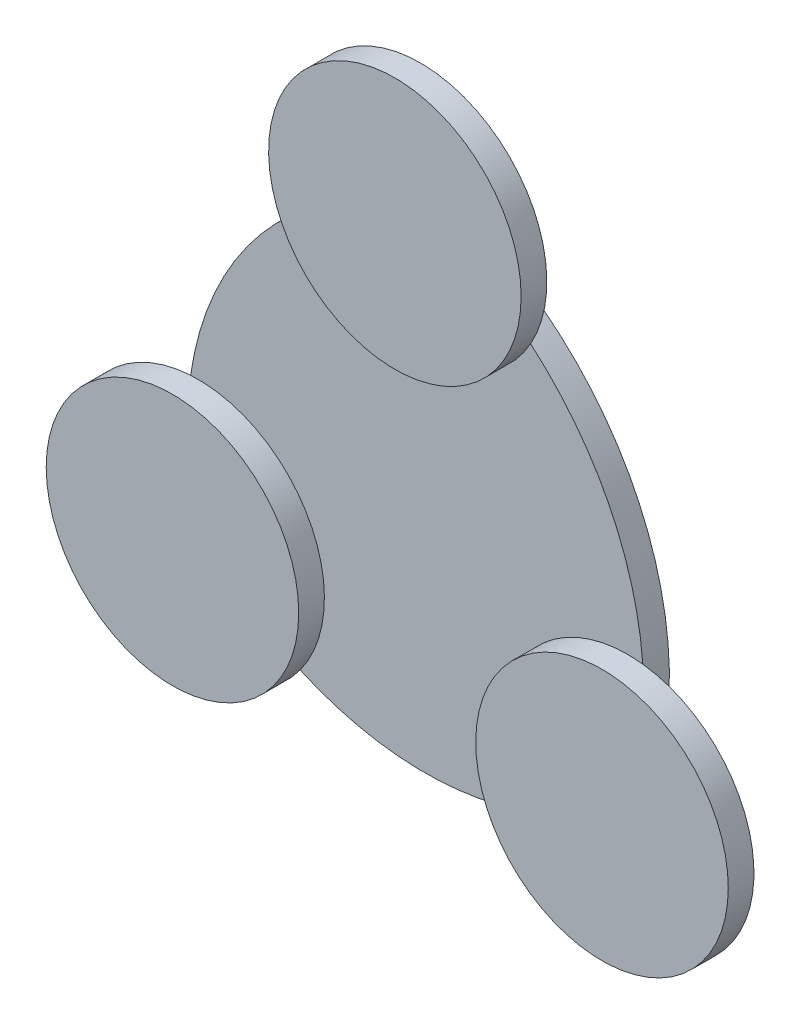
ISO-10303-21;
HEADER;
FILE_DESCRIPTION(('STEP AP214'),'2;1');
FILE_NAME('part.step','',(''),(''),'','','');
FILE_SCHEMA(('AUTOMOTIVE_DESIGN { 1 0 10303 214 1 1 1 1 }'));
ENDSEC;
DATA;
#1=APPLICATION_CONTEXT('core data for automotive mechanical design processes');
#2=APPLICATION_PROTOCOL_DEFINITION('international standard','automotive_design',2000,#1);
#3=PRODUCT_CONTEXT('',#1,'mechanical');
#4=PRODUCT('Part','Part','',(#3));
#5=PRODUCT_RELATED_PRODUCT_CATEGORY('part','',(#4));
#6=PRODUCT_DEFINITION_FORMATION('','',#4);
#7=PRODUCT_DEFINITION_CONTEXT('part definition',#1,'design');
#8=PRODUCT_DEFINITION('design','',#6,#7);
#9=PRODUCT_DEFINITION_SHAPE('','',#8);
#10=(LENGTH_UNIT() NAMED_UNIT(*) SI_UNIT(.MILLI.,.METRE.));
#11=(NAMED_UNIT(*) PLANE_ANGLE_UNIT() SI_UNIT($,.RADIAN.));
#12=(NAMED_UNIT(*) SI_UNIT($,.STERADIAN.) SOLID_ANGLE_UNIT());
#13=UNCERTAINTY_MEASURE_WITH_UNIT(LENGTH_MEASURE(1.E-05),#10,'distance_accuracy_value','');
#14=(GEOMETRIC_REPRESENTATION_CONTEXT(3) GLOBAL_UNCERTAINTY_ASSIGNED_CONTEXT((#13)) GLOBAL_UNIT_ASSIGNED_CONTEXT((#10,
#11,#12)) REPRESENTATION_CONTEXT('',''));
#15=CARTESIAN_POINT('',(0.,0.,0.));
#16=DIRECTION('',(0.,0.,1.));
#17=DIRECTION('',(1.,0.,0.));
#18=AXIS2_PLACEMENT_3D('',#15,#16,#17);
#19=CARTESIAN_POINT('',(4.9924044219722,1.61592345324425,0.));
#20=DIRECTION('',(0.,0.,1.));
#21=DIRECTION('',(1.,0.,0.));
#22=AXIS2_PLACEMENT_3D('',#19,#20,#21);
#23=PLANE('',#22);
#24=CARTESIAN_POINT('',(9.5096189432336,-5.49038105676665,0.));
#25=DIRECTION('',(0.,0.,1.));
#26=DIRECTION('',(1.,0.,0.));
#27=AXIS2_PLACEMENT_3D('',#24,#25,#26);
#28=CIRCLE('',#27,36.7423461417478);
#29=CARTESIAN_POINT('',(0.,30.,0.));
#30=VERTEX_POINT('',#29);
#31=CARTESIAN_POINT('',(-25.9807621135331,-15.0000000000001,0.));
#32=VERTEX_POINT('',#31);
#33=EDGE_CURVE('E128',#30,#32,#28,.T.);
#34=ORIENTED_EDGE('',*,*,#33,.F.);
#35=CARTESIAN_POINT('',(-11.7681530935115,-5.96557095747744,0.));
#36=DIRECTION('',(0.,0.,1.));
#37=DIRECTION('',(-1.,0.,0.));
#38=AXIS2_PLACEMENT_3D('',#35,#36,#37);
#39=CIRCLE('',#38,37.8419307320553);
#40=CARTESIAN_POINT('',(24.197417863966,-17.7337240509888,0.));
#41=VERTEX_POINT('',#40);
#42=EDGE_CURVE('E143',#41,#30,#39,.T.);
#43=ORIENTED_EDGE('',*,*,#42,.F.);
#44=CARTESIAN_POINT('',(0.475189900710804,8.72222796325515,0.));
#45=DIRECTION('',(0.,0.,1.));
#46=DIRECTION('',(-1.,0.,0.));
#47=AXIS2_PLACEMENT_3D('',#44,#45,#46);
#48=CIRCLE('',#47,35.5339485073166);
#49=EDGE_CURVE('E141',#32,#41,#48,.T.);
#50=ORIENTED_EDGE('',*,*,#49,.F.);
#51=EDGE_LOOP('',(#34,#43,#50));
#52=FACE_BOUND('',#51,.T.);
#53=CARTESIAN_POINT('',(0.,0.,0.));
#54=DIRECTION('',(0.,0.,1.));
#55=DIRECTION('',(1.,0.,0.));
#56=AXIS2_PLACEMENT_3D('',#53,#54,#55);
#57=CIRCLE('',#56,15.25);
#58=CARTESIAN_POINT('',(15.25,0.,0.));
#59=VERTEX_POINT('',#58);
#60=EDGE_CURVE('E11',#59,#59,#57,.F.);
#61=ORIENTED_EDGE('',*,*,#60,.F.);
#62=EDGE_LOOP('',(#61));
#63=FACE_BOUND('',#62,.T.);
#64=ADVANCED_FACE('F33',(#52,#63),#23,.F.);
#65=CARTESIAN_POINT('',(4.9924044219722,1.61592345324425,3.));
#66=DIRECTION('',(0.,0.,1.));
#67=DIRECTION('',(1.,0.,0.));
#68=AXIS2_PLACEMENT_3D('',#65,#66,#67);
#69=PLANE('',#68);
#70=CARTESIAN_POINT('',(9.5096189432336,-5.49038105676665,3.));
#71=DIRECTION('',(0.,0.,1.));
#72=DIRECTION('',(1.,0.,0.));
#73=AXIS2_PLACEMENT_3D('',#70,#71,#72);
#74=CIRCLE('',#73,36.7423461417478);
#75=CARTESIAN_POINT('',(-13.1911731953647,23.4003447264352,3.));
#76=VERTEX_POINT('',#75);
#77=CARTESIAN_POINT('',(-26.8608795880884,-0.276281270311544,3.));
#78=VERTEX_POINT('',#77);
#79=EDGE_CURVE('E102',#76,#78,#74,.T.);
#80=ORIENTED_EDGE('',*,*,#79,.T.);
#81=CARTESIAN_POINT('',(-25.9807621135331,-15.0000000000001,3.));
#82=DIRECTION('',(0.,0.,1.));
#83=DIRECTION('',(1.,0.,0.));
#84=AXIS2_PLACEMENT_3D('',#81,#82,#83);
#85=CIRCLE('',#84,14.75);
#86=CARTESIAN_POINT('',(-14.0689378696031,-23.6989047116131,3.));
#87=VERTEX_POINT('',#86);
#88=EDGE_CURVE('E100',#87,#78,#85,.T.);
#89=ORIENTED_EDGE('',*,*,#88,.F.);
#90=CARTESIAN_POINT('',(0.475189900710804,8.72222796325515,3.));
#91=DIRECTION('',(0.,0.,1.));
#92=DIRECTION('',(-1.,0.,0.));
#93=AXIS2_PLACEMENT_3D('',#90,#91,#92);
#94=CIRCLE('',#93,35.5339485073166);
#95=CARTESIAN_POINT('',(11.4110619744423,-25.0870636369486,3.));
#96=VERTEX_POINT('',#95);
#97=EDGE_CURVE('E88',#87,#96,#94,.T.);
#98=ORIENTED_EDGE('',*,*,#97,.T.);
#99=CARTESIAN_POINT('',(24.197417863966,-17.7337240509888,3.));
#100=DIRECTION('',(0.,0.,1.));
#101=DIRECTION('',(1.,0.,0.));
#102=AXIS2_PLACEMENT_3D('',#99,#100,#101);
#103=CIRCLE('',#102,14.75);
#104=CARTESIAN_POINT('',(25.9643589696275,-3.08993973377339,3.));
#105=VERTEX_POINT('',#104);
#106=EDGE_CURVE('E123',#105,#96,#103,.T.);
#107=ORIENTED_EDGE('',*,*,#106,.F.);
#108=CARTESIAN_POINT('',(-11.7681530935115,-5.96557095747744,3.));
#109=DIRECTION('',(0.,0.,1.));
#110=DIRECTION('',(-1.,0.,0.));
#111=AXIS2_PLACEMENT_3D('',#108,#109,#110);
#112=CIRCLE('',#111,37.8419307320553);
#113=CARTESIAN_POINT('',(12.8558738071868,22.7688860710338,3.));
#114=VERTEX_POINT('',#113);
#115=EDGE_CURVE('E138',#105,#114,#112,.T.);
#116=ORIENTED_EDGE('',*,*,#115,.T.);
#117=CARTESIAN_POINT('',(0.,30.,3.));
#118=DIRECTION('',(0.,0.,1.));
#119=DIRECTION('',(1.,0.,0.));
#120=AXIS2_PLACEMENT_3D('',#117,#118,#119);
#121=CIRCLE('',#120,14.75);
#122=EDGE_CURVE('E129',#76,#114,#121,.T.);
#123=ORIENTED_EDGE('',*,*,#122,.F.);
#124=EDGE_LOOP('',(#80,#89,#98,#107,#116,#123));
#125=FACE_BOUND('',#124,.T.);
#126=ADVANCED_FACE('F101',(#125),#69,.T.);
#127=CARTESIAN_POINT('',(9.5096189432336,-5.49038105676665,3.));
#128=DIRECTION('',(0.,0.,-1.));
#129=DIRECTION('',(-1.,0.,0.));
#130=AXIS2_PLACEMENT_3D('',#127,#128,#129);
#131=CYLINDRICAL_SURFACE('',#130,36.7423461417478);
#132=ORIENTED_EDGE('',*,*,#33,.T.);
#133=DIRECTION('',(0.,0.,-1.));
#134=VECTOR('',#133,1.);
#135=CARTESIAN_POINT('',(-25.9807621135331,-15.0000000000001,3.));
#136=LINE('',#135,#134);
#137=CARTESIAN_POINT('',(-25.9807621135331,-15.0000000000001,3.));
#138=VERTEX_POINT('',#137);
#139=EDGE_CURVE('E41',#138,#32,#136,.T.);
#140=ORIENTED_EDGE('',*,*,#139,.F.);
#141=CARTESIAN_POINT('',(9.5096189432336,-5.49038105676665,3.));
#142=DIRECTION('',(0.,0.,1.));
#143=DIRECTION('',(1.,0.,0.));
#144=AXIS2_PLACEMENT_3D('',#141,#142,#143);
#145=CIRCLE('',#144,36.7423461417478);
#146=EDGE_CURVE('E48',#78,#138,#145,.T.);
#147=ORIENTED_EDGE('',*,*,#146,.F.);
#148=ORIENTED_EDGE('',*,*,#79,.F.);
#149=CARTESIAN_POINT('',(0.,30.,3.));
#150=VERTEX_POINT('',#149);
#151=EDGE_CURVE('E132',#150,#76,#74,.T.);
#152=ORIENTED_EDGE('',*,*,#151,.F.);
#153=DIRECTION('',(0.,0.,-1.));
#154=VECTOR('',#153,1.);
#155=CARTESIAN_POINT('',(0.,30.,3.));
#156=LINE('',#155,#154);
#157=EDGE_CURVE('E137',#150,#30,#156,.T.);
#158=ORIENTED_EDGE('',*,*,#157,.T.);
#159=EDGE_LOOP('',(#132,#140,#147,#148,#152,#158));
#160=FACE_BOUND('',#159,.T.);
#161=ADVANCED_FACE('F35',(#160),#131,.T.);
#162=CARTESIAN_POINT('',(0.475189900710804,8.72222796325515,3.));
#163=DIRECTION('',(0.,0.,-1.));
#164=DIRECTION('',(-1.,0.,0.));
#165=AXIS2_PLACEMENT_3D('',#162,#163,#164);
#166=CYLINDRICAL_SURFACE('',#165,35.5339485073166);
#167=ORIENTED_EDGE('',*,*,#49,.T.);
#168=DIRECTION('',(0.,0.,-1.));
#169=VECTOR('',#168,1.);
#170=CARTESIAN_POINT('',(24.197417863966,-17.7337240509888,3.));
#171=LINE('',#170,#169);
#172=CARTESIAN_POINT('',(24.197417863966,-17.7337240509888,3.));
#173=VERTEX_POINT('',#172);
#174=EDGE_CURVE('E147',#173,#41,#171,.T.);
#175=ORIENTED_EDGE('',*,*,#174,.F.);
#176=EDGE_CURVE('E95',#96,#173,#94,.T.);
#177=ORIENTED_EDGE('',*,*,#176,.F.);
#178=ORIENTED_EDGE('',*,*,#97,.F.);
#179=EDGE_CURVE('E93',#138,#87,#94,.T.);
#180=ORIENTED_EDGE('',*,*,#179,.F.);
#181=ORIENTED_EDGE('',*,*,#139,.T.);
#182=EDGE_LOOP('',(#167,#175,#177,#178,#180,#181));
#183=FACE_BOUND('',#182,.T.);
#184=ADVANCED_FACE('F90',(#183),#166,.T.);
#185=CARTESIAN_POINT('',(-11.7681530935115,-5.96557095747744,3.));
#186=DIRECTION('',(0.,0.,-1.));
#187=DIRECTION('',(-1.,0.,0.));
#188=AXIS2_PLACEMENT_3D('',#185,#186,#187);
#189=CYLINDRICAL_SURFACE('',#188,37.8419307320553);
#190=ORIENTED_EDGE('',*,*,#42,.T.);
#191=ORIENTED_EDGE('',*,*,#157,.F.);
#192=EDGE_CURVE('E111',#114,#150,#112,.T.);
#193=ORIENTED_EDGE('',*,*,#192,.F.);
#194=ORIENTED_EDGE('',*,*,#115,.F.);
#195=EDGE_CURVE('E135',#173,#105,#112,.T.);
#196=ORIENTED_EDGE('',*,*,#195,.F.);
#197=ORIENTED_EDGE('',*,*,#174,.T.);
#198=EDGE_LOOP('',(#190,#191,#193,#194,#196,#197));
#199=FACE_BOUND('',#198,.T.);
#200=ADVANCED_FACE('F155',(#199),#189,.T.);
#201=CARTESIAN_POINT('',(0.,30.,3.));
#202=DIRECTION('',(0.,0.,1.));
#203=DIRECTION('',(1.,0.,0.));
#204=AXIS2_PLACEMENT_3D('',#201,#202,#203);
#205=PLANE('',#204);
#206=ORIENTED_EDGE('',*,*,#192,.T.);
#207=ORIENTED_EDGE('',*,*,#151,.T.);
#208=EDGE_CURVE('E122',#114,#76,#121,.T.);
#209=ORIENTED_EDGE('',*,*,#208,.F.);
#210=EDGE_LOOP('',(#206,#207,#209));
#211=FACE_BOUND('',#210,.T.);
#212=ADVANCED_FACE('F269',(#211),#205,.F.);
#213=CARTESIAN_POINT('',(0.,30.,6.));
#214=DIRECTION('',(0.,0.,-1.));
#215=DIRECTION('',(-1.,0.,0.));
#216=AXIS2_PLACEMENT_3D('',#213,#214,#215);
#217=CYLINDRICAL_SURFACE('',#216,14.75);
#218=CARTESIAN_POINT('',(0.,30.,6.));
#219=DIRECTION('',(0.,0.,1.));
#220=DIRECTION('',(1.,0.,0.));
#221=AXIS2_PLACEMENT_3D('',#218,#219,#220);
#222=CIRCLE('',#221,14.75);
#223=CARTESIAN_POINT('',(14.75,30.,6.));
#224=VERTEX_POINT('',#223);
#225=EDGE_CURVE('E125',#224,#224,#222,.T.);
#226=ORIENTED_EDGE('',*,*,#225,.F.);
#227=EDGE_LOOP('',(#226));
#228=FACE_BOUND('',#227,.T.);
#229=ORIENTED_EDGE('',*,*,#122,.T.);
#230=ORIENTED_EDGE('',*,*,#208,.T.);
#231=EDGE_LOOP('',(#229,#230));
#232=FACE_BOUND('',#231,.T.);
#233=ADVANCED_FACE('F275',(#228,#232),#217,.T.);
#234=CARTESIAN_POINT('',(0.,30.,6.));
#235=DIRECTION('',(0.,0.,1.));
#236=DIRECTION('',(1.,0.,0.));
#237=AXIS2_PLACEMENT_3D('',#234,#235,#236);
#238=PLANE('',#237);
#239=ORIENTED_EDGE('',*,*,#225,.T.);
#240=EDGE_LOOP('',(#239));
#241=FACE_BOUND('',#240,.T.);
#242=ADVANCED_FACE('F172',(#241),#238,.T.);
#243=CARTESIAN_POINT('',(24.197417863966,-17.7337240509888,3.));
#244=DIRECTION('',(0.,0.,1.));
#245=DIRECTION('',(1.,0.,0.));
#246=AXIS2_PLACEMENT_3D('',#243,#244,#245);
#247=PLANE('',#246);
#248=EDGE_CURVE('E55',#96,#105,#103,.T.);
#249=ORIENTED_EDGE('',*,*,#248,.F.);
#250=ORIENTED_EDGE('',*,*,#176,.T.);
#251=ORIENTED_EDGE('',*,*,#195,.T.);
#252=EDGE_LOOP('',(#249,#250,#251));
#253=FACE_BOUND('',#252,.T.);
#254=ADVANCED_FACE('F160',(#253),#247,.F.);
#255=CARTESIAN_POINT('',(24.197417863966,-17.7337240509888,6.));
#256=DIRECTION('',(0.,0.,-1.));
#257=DIRECTION('',(-1.,0.,0.));
#258=AXIS2_PLACEMENT_3D('',#255,#256,#257);
#259=CYLINDRICAL_SURFACE('',#258,14.75);
#260=CARTESIAN_POINT('',(24.197417863966,-17.7337240509888,6.));
#261=DIRECTION('',(0.,0.,1.));
#262=DIRECTION('',(1.,0.,0.));
#263=AXIS2_PLACEMENT_3D('',#260,#261,#262);
#264=CIRCLE('',#263,14.75);
#265=CARTESIAN_POINT('',(38.947417863966,-17.7337240509888,6.));
#266=VERTEX_POINT('',#265);
#267=EDGE_CURVE('E119',#266,#266,#264,.T.);
#268=ORIENTED_EDGE('',*,*,#267,.F.);
#269=EDGE_LOOP('',(#268));
#270=FACE_BOUND('',#269,.T.);
#271=ORIENTED_EDGE('',*,*,#106,.T.);
#272=ORIENTED_EDGE('',*,*,#248,.T.);
#273=EDGE_LOOP('',(#271,#272));
#274=FACE_BOUND('',#273,.T.);
#275=ADVANCED_FACE('F161',(#270,#274),#259,.T.);
#276=CARTESIAN_POINT('',(24.197417863966,-17.7337240509888,6.));
#277=DIRECTION('',(0.,0.,1.));
#278=DIRECTION('',(1.,0.,0.));
#279=AXIS2_PLACEMENT_3D('',#276,#277,#278);
#280=PLANE('',#279);
#281=ORIENTED_EDGE('',*,*,#267,.T.);
#282=EDGE_LOOP('',(#281));
#283=FACE_BOUND('',#282,.T.);
#284=ADVANCED_FACE('F163',(#283),#280,.T.);
#285=CARTESIAN_POINT('',(-25.9807621135331,-15.0000000000001,3.));
#286=DIRECTION('',(0.,0.,1.));
#287=DIRECTION('',(1.,0.,0.));
#288=AXIS2_PLACEMENT_3D('',#285,#286,#287);
#289=PLANE('',#288);
#290=EDGE_CURVE('E106',#78,#87,#85,.T.);
#291=ORIENTED_EDGE('',*,*,#290,.F.);
#292=ORIENTED_EDGE('',*,*,#146,.T.);
#293=ORIENTED_EDGE('',*,*,#179,.T.);
#294=EDGE_LOOP('',(#291,#292,#293));
#295=FACE_BOUND('',#294,.T.);
#296=ADVANCED_FACE('F110',(#295),#289,.F.);
#297=CARTESIAN_POINT('',(-25.9807621135331,-15.0000000000001,6.));
#298=DIRECTION('',(0.,0.,-1.));
#299=DIRECTION('',(-1.,0.,0.));
#300=AXIS2_PLACEMENT_3D('',#297,#298,#299);
#301=CYLINDRICAL_SURFACE('',#300,14.75);
#302=CARTESIAN_POINT('',(-25.9807621135331,-15.0000000000001,6.));
#303=DIRECTION('',(0.,0.,1.));
#304=DIRECTION('',(1.,0.,0.));
#305=AXIS2_PLACEMENT_3D('',#302,#303,#304);
#306=CIRCLE('',#305,14.75);
#307=CARTESIAN_POINT('',(-11.2307621135331,-15.0000000000001,6.));
#308=VERTEX_POINT('',#307);
#309=EDGE_CURVE('E113',#308,#308,#306,.T.);
#310=ORIENTED_EDGE('',*,*,#309,.F.);
#311=EDGE_LOOP('',(#310));
#312=FACE_BOUND('',#311,.T.);
#313=ORIENTED_EDGE('',*,*,#290,.T.);
#314=ORIENTED_EDGE('',*,*,#88,.T.);
#315=EDGE_LOOP('',(#313,#314));
#316=FACE_BOUND('',#315,.T.);
#317=ADVANCED_FACE('F112',(#312,#316),#301,.T.);
#318=CARTESIAN_POINT('',(-25.9807621135331,-15.0000000000001,6.));
#319=DIRECTION('',(0.,0.,1.));
#320=DIRECTION('',(1.,0.,0.));
#321=AXIS2_PLACEMENT_3D('',#318,#319,#320);
#322=PLANE('',#321);
#323=ORIENTED_EDGE('',*,*,#309,.T.);
#324=EDGE_LOOP('',(#323));
#325=FACE_BOUND('',#324,.T.);
#326=ADVANCED_FACE('F214',(#325),#322,.T.);
#327=CARTESIAN_POINT('',(0.,0.,-3.));
#328=DIRECTION('',(0.,0.,-1.));
#329=DIRECTION('',(-1.,0.,0.));
#330=AXIS2_PLACEMENT_3D('',#327,#328,#329);
#331=PLANE('',#330);
#332=CARTESIAN_POINT('',(0.,0.,-3.));
#333=DIRECTION('',(0.,0.,-1.));
#334=DIRECTION('',(-1.,0.,0.));
#335=AXIS2_PLACEMENT_3D('',#332,#333,#334);
#336=CIRCLE('',#335,15.25);
#337=CARTESIAN_POINT('',(-15.25,0.,-3.));
#338=VERTEX_POINT('',#337);
#339=EDGE_CURVE('E107',#338,#338,#336,.T.);
#340=ORIENTED_EDGE('',*,*,#339,.T.);
#341=EDGE_LOOP('',(#340));
#342=FACE_BOUND('',#341,.T.);
#343=CARTESIAN_POINT('',(0.,0.,-3.));
#344=DIRECTION('',(0.,0.,-1.));
#345=DIRECTION('',(-1.,0.,0.));
#346=AXIS2_PLACEMENT_3D('',#343,#344,#345);
#347=CIRCLE('',#346,14.75);
#348=CARTESIAN_POINT('',(-14.75,0.,-3.));
#349=VERTEX_POINT('',#348);
#350=EDGE_CURVE('E197',#349,#349,#347,.T.);
#351=ORIENTED_EDGE('',*,*,#350,.F.);
#352=EDGE_LOOP('',(#351));
#353=FACE_BOUND('',#352,.T.);
#354=ADVANCED_FACE('F204',(#342,#353),#331,.T.);
#355=CARTESIAN_POINT('',(0.,0.,-3.));
#356=DIRECTION('',(0.,0.,1.));
#357=DIRECTION('',(1.,0.,0.));
#358=AXIS2_PLACEMENT_3D('',#355,#356,#357);
#359=CYLINDRICAL_SURFACE('',#358,15.25);
#360=ORIENTED_EDGE('',*,*,#339,.F.);
#361=EDGE_LOOP('',(#360));
#362=FACE_BOUND('',#361,.T.);
#363=ORIENTED_EDGE('',*,*,#60,.T.);
#364=EDGE_LOOP('',(#363));
#365=FACE_BOUND('',#364,.T.);
#366=ADVANCED_FACE('F190',(#362,#365),#359,.T.);
#367=CARTESIAN_POINT('',(0.,0.,-3.));
#368=DIRECTION('',(0.,0.,1.));
#369=DIRECTION('',(1.,0.,0.));
#370=AXIS2_PLACEMENT_3D('',#367,#368,#369);
#371=CYLINDRICAL_SURFACE('',#370,14.75);
#372=ORIENTED_EDGE('',*,*,#350,.T.);
#373=EDGE_LOOP('',(#372));
#374=FACE_BOUND('',#373,.T.);
#375=CARTESIAN_POINT('',(0.,0.,0.));
#376=DIRECTION('',(0.,0.,-1.));
#377=DIRECTION('',(-1.,0.,0.));
#378=AXIS2_PLACEMENT_3D('',#375,#376,#377);
#379=CIRCLE('',#378,14.75);
#380=CARTESIAN_POINT('',(-14.75,0.,0.));
#381=VERTEX_POINT('',#380);
#382=EDGE_CURVE('E195',#381,#381,#379,.T.);
#383=ORIENTED_EDGE('',*,*,#382,.F.);
#384=EDGE_LOOP('',(#383));
#385=FACE_BOUND('',#384,.T.);
#386=ADVANCED_FACE('F185',(#374,#385),#371,.F.);
#387=ORIENTED_EDGE('',*,*,#382,.T.);
#388=EDGE_LOOP('',(#387));
#389=FACE_BOUND('',#388,.T.);
#390=ADVANCED_FACE('F178',(#389),#23,.F.);
#391=CLOSED_SHELL('',(#64,#126,#161,#184,#200,#212,#233,#242,#254,#275,#284,#296,#317,#326,#354,
#366,#386,#390));
#392=MANIFOLD_SOLID_BREP('B2',#391);
#393=ADVANCED_BREP_SHAPE_REPRESENTATION('',(#18,#392),#14);
#394=SHAPE_DEFINITION_REPRESENTATION(#9,#393);
ENDSEC;
END-ISO-10303-21;
